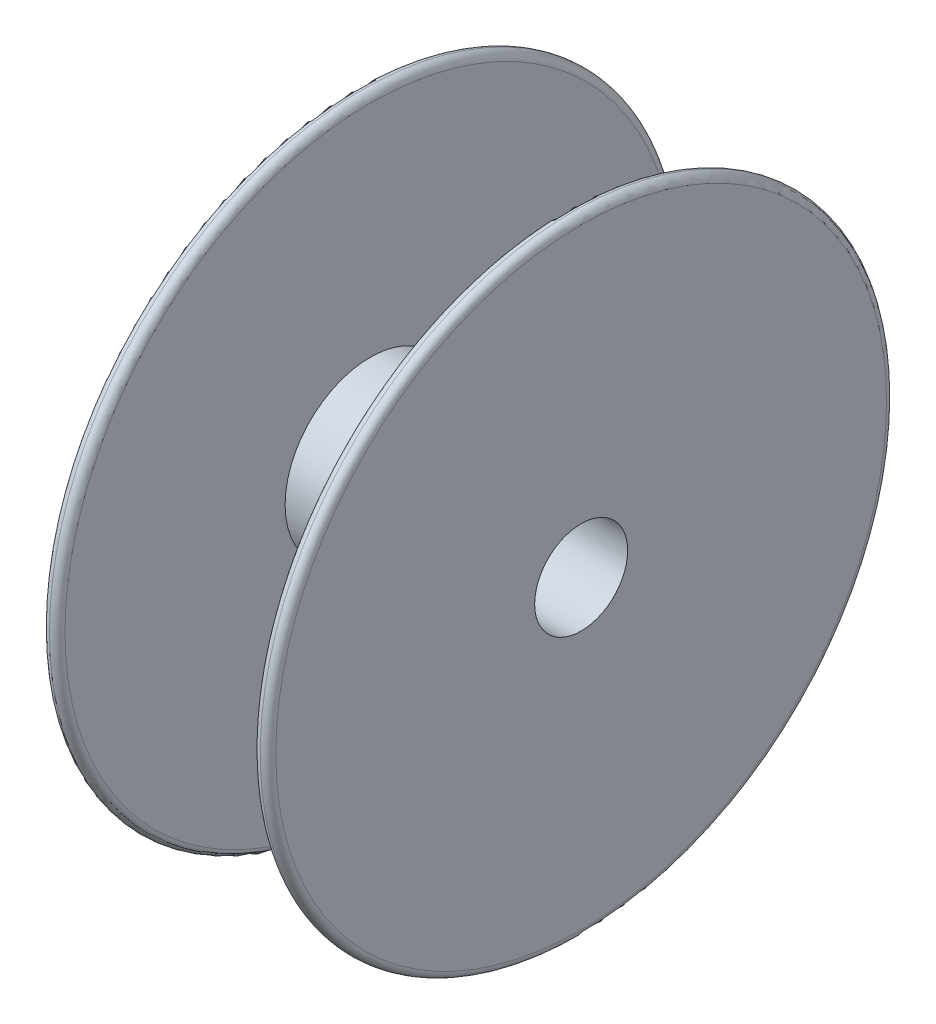
ISO-10303-21;
HEADER;
FILE_DESCRIPTION(('STEP AP214'),'2;1');
FILE_NAME('part.step','',(''),(''),'','','');
FILE_SCHEMA(('AUTOMOTIVE_DESIGN { 1 0 10303 214 1 1 1 1 }'));
ENDSEC;
DATA;
#1=APPLICATION_CONTEXT('core data for automotive mechanical design processes');
#2=APPLICATION_PROTOCOL_DEFINITION('international standard','automotive_design',2000,#1);
#3=PRODUCT_CONTEXT('',#1,'mechanical');
#4=PRODUCT('Part','Part','',(#3));
#5=PRODUCT_RELATED_PRODUCT_CATEGORY('part','',(#4));
#6=PRODUCT_DEFINITION_FORMATION('','',#4);
#7=PRODUCT_DEFINITION_CONTEXT('part definition',#1,'design');
#8=PRODUCT_DEFINITION('design','',#6,#7);
#9=PRODUCT_DEFINITION_SHAPE('','',#8);
#10=(LENGTH_UNIT() NAMED_UNIT(*) SI_UNIT(.MILLI.,.METRE.));
#11=(NAMED_UNIT(*) PLANE_ANGLE_UNIT() SI_UNIT($,.RADIAN.));
#12=(NAMED_UNIT(*) SI_UNIT($,.STERADIAN.) SOLID_ANGLE_UNIT());
#13=UNCERTAINTY_MEASURE_WITH_UNIT(LENGTH_MEASURE(1.E-05),#10,'distance_accuracy_value','');
#14=(GEOMETRIC_REPRESENTATION_CONTEXT(3) GLOBAL_UNCERTAINTY_ASSIGNED_CONTEXT((#13)) GLOBAL_UNIT_ASSIGNED_CONTEXT((#10,
#11,#12)) REPRESENTATION_CONTEXT('',''));
#15=CARTESIAN_POINT('',(0.,0.,0.));
#16=DIRECTION('',(0.,0.,1.));
#17=DIRECTION('',(1.,0.,0.));
#18=AXIS2_PLACEMENT_3D('',#15,#16,#17);
#19=CARTESIAN_POINT('',(63.,0.,0.));
#20=DIRECTION('',(-1.,0.,0.));
#21=DIRECTION('',(0.,0.,1.));
#22=AXIS2_PLACEMENT_3D('',#19,#20,#21);
#23=CYLINDRICAL_SURFACE('',#22,27.5);
#24=CARTESIAN_POINT('',(63.,0.,0.));
#25=DIRECTION('',(1.,0.,0.));
#26=DIRECTION('',(0.,0.,-1.));
#27=AXIS2_PLACEMENT_3D('',#24,#25,#26);
#28=CIRCLE('',#27,27.5);
#29=CARTESIAN_POINT('',(63.,0.,-27.5));
#30=VERTEX_POINT('',#29);
#31=EDGE_CURVE('E103',#30,#30,#28,.T.);
#32=ORIENTED_EDGE('',*,*,#31,.F.);
#33=EDGE_LOOP('',(#32));
#34=FACE_BOUND('',#33,.T.);
#35=CARTESIAN_POINT('',(0.,0.,0.));
#36=DIRECTION('',(-1.,0.,0.));
#37=DIRECTION('',(0.,0.,1.));
#38=AXIS2_PLACEMENT_3D('',#35,#36,#37);
#39=CIRCLE('',#38,27.5);
#40=CARTESIAN_POINT('',(0.,0.,27.5));
#41=VERTEX_POINT('',#40);
#42=EDGE_CURVE('E57',#41,#41,#39,.T.);
#43=ORIENTED_EDGE('',*,*,#42,.F.);
#44=EDGE_LOOP('',(#43));
#45=FACE_BOUND('',#44,.T.);
#46=ADVANCED_FACE('F35',(#34,#45),#23,.T.);
#47=CARTESIAN_POINT('',(63.,0.,0.));
#48=DIRECTION('',(-1.,0.,0.));
#49=DIRECTION('',(0.,0.,1.));
#50=AXIS2_PLACEMENT_3D('',#47,#48,#49);
#51=CYLINDRICAL_SURFACE('',#50,15.);
#52=CARTESIAN_POINT('',(68.,0.,0.));
#53=DIRECTION('',(1.,0.,0.));
#54=DIRECTION('',(0.,0.,-1.));
#55=AXIS2_PLACEMENT_3D('',#52,#53,#54);
#56=CIRCLE('',#55,15.);
#57=CARTESIAN_POINT('',(68.,0.,-15.));
#58=VERTEX_POINT('',#57);
#59=EDGE_CURVE('E108',#58,#58,#56,.T.);
#60=ORIENTED_EDGE('',*,*,#59,.T.);
#61=EDGE_LOOP('',(#60));
#62=FACE_BOUND('',#61,.T.);
#63=CARTESIAN_POINT('',(-5.,0.,0.));
#64=DIRECTION('',(-1.,0.,0.));
#65=DIRECTION('',(0.,0.,1.));
#66=AXIS2_PLACEMENT_3D('',#63,#64,#65);
#67=CIRCLE('',#66,15.);
#68=CARTESIAN_POINT('',(-5.,0.,15.));
#69=VERTEX_POINT('',#68);
#70=EDGE_CURVE('E53',#69,#69,#67,.T.);
#71=ORIENTED_EDGE('',*,*,#70,.T.);
#72=EDGE_LOOP('',(#71));
#73=FACE_BOUND('',#72,.T.);
#74=ADVANCED_FACE('F75',(#62,#73),#51,.F.);
#75=CARTESIAN_POINT('',(63.,0.,0.));
#76=DIRECTION('',(1.,0.,0.));
#77=DIRECTION('',(0.,0.,-1.));
#78=AXIS2_PLACEMENT_3D('',#75,#76,#77);
#79=PLANE('',#78);
#80=CARTESIAN_POINT('',(63.,0.,0.));
#81=DIRECTION('',(1.,0.,0.));
#82=DIRECTION('',(0.,0.,-1.));
#83=AXIS2_PLACEMENT_3D('',#80,#81,#82);
#84=CIRCLE('',#83,98.5);
#85=CARTESIAN_POINT('',(63.,0.,-98.5));
#86=VERTEX_POINT('',#85);
#87=EDGE_CURVE('E43',#86,#86,#84,.F.);
#88=ORIENTED_EDGE('',*,*,#87,.T.);
#89=EDGE_LOOP('',(#88));
#90=FACE_BOUND('',#89,.T.);
#91=ORIENTED_EDGE('',*,*,#31,.T.);
#92=EDGE_LOOP('',(#91));
#93=FACE_BOUND('',#92,.T.);
#94=ADVANCED_FACE('F81',(#90,#93),#79,.F.);
#95=CARTESIAN_POINT('',(68.,0.,0.));
#96=DIRECTION('',(1.,0.,0.));
#97=DIRECTION('',(0.,0.,-1.));
#98=AXIS2_PLACEMENT_3D('',#95,#96,#97);
#99=PLANE('',#98);
#100=CARTESIAN_POINT('',(68.,0.,0.));
#101=DIRECTION('',(1.,0.,0.));
#102=DIRECTION('',(0.,0.,-1.));
#103=AXIS2_PLACEMENT_3D('',#100,#101,#102);
#104=CIRCLE('',#103,98.5);
#105=CARTESIAN_POINT('',(68.,0.,-98.5));
#106=VERTEX_POINT('',#105);
#107=EDGE_CURVE('E10',#106,#106,#104,.T.);
#108=ORIENTED_EDGE('',*,*,#107,.T.);
#109=EDGE_LOOP('',(#108));
#110=FACE_BOUND('',#109,.T.);
#111=ORIENTED_EDGE('',*,*,#59,.F.);
#112=EDGE_LOOP('',(#111));
#113=FACE_BOUND('',#112,.T.);
#114=ADVANCED_FACE('F115',(#110,#113),#99,.T.);
#115=CARTESIAN_POINT('',(0.,0.,0.));
#116=DIRECTION('',(-1.,0.,0.));
#117=DIRECTION('',(0.,0.,1.));
#118=AXIS2_PLACEMENT_3D('',#115,#116,#117);
#119=PLANE('',#118);
#120=CARTESIAN_POINT('',(0.,0.,0.));
#121=DIRECTION('',(-1.,0.,0.));
#122=DIRECTION('',(0.,0.,1.));
#123=AXIS2_PLACEMENT_3D('',#120,#121,#122);
#124=CIRCLE('',#123,98.5);
#125=CARTESIAN_POINT('',(0.,0.,98.5));
#126=VERTEX_POINT('',#125);
#127=EDGE_CURVE('E48',#126,#126,#124,.F.);
#128=ORIENTED_EDGE('',*,*,#127,.T.);
#129=EDGE_LOOP('',(#128));
#130=FACE_BOUND('',#129,.T.);
#131=ORIENTED_EDGE('',*,*,#42,.T.);
#132=EDGE_LOOP('',(#131));
#133=FACE_BOUND('',#132,.T.);
#134=ADVANCED_FACE('F94',(#130,#133),#119,.F.);
#135=CARTESIAN_POINT('',(-5.,0.,0.));
#136=DIRECTION('',(-1.,0.,0.));
#137=DIRECTION('',(0.,0.,1.));
#138=AXIS2_PLACEMENT_3D('',#135,#136,#137);
#139=PLANE('',#138);
#140=CARTESIAN_POINT('',(-5.,0.,0.));
#141=DIRECTION('',(-1.,0.,0.));
#142=DIRECTION('',(0.,0.,1.));
#143=AXIS2_PLACEMENT_3D('',#140,#141,#142);
#144=CIRCLE('',#143,98.5);
#145=CARTESIAN_POINT('',(-5.,0.,98.5));
#146=VERTEX_POINT('',#145);
#147=EDGE_CURVE('E101',#146,#146,#144,.T.);
#148=ORIENTED_EDGE('',*,*,#147,.T.);
#149=EDGE_LOOP('',(#148));
#150=FACE_BOUND('',#149,.T.);
#151=ORIENTED_EDGE('',*,*,#70,.F.);
#152=EDGE_LOOP('',(#151));
#153=FACE_BOUND('',#152,.T.);
#154=ADVANCED_FACE('F89',(#150,#153),#139,.T.);
#155=CARTESIAN_POINT('',(-2.5,0.,0.));
#156=DIRECTION('',(-1.,0.,0.));
#157=DIRECTION('',(0.,0.,1.));
#158=AXIS2_PLACEMENT_3D('',#155,#156,#157);
#159=TOROIDAL_SURFACE('',#158,98.5,2.5);
#160=ORIENTED_EDGE('',*,*,#127,.F.);
#161=EDGE_LOOP('',(#160));
#162=FACE_BOUND('',#161,.T.);
#163=CARTESIAN_POINT('',(-2.5,0.,0.));
#164=DIRECTION('',(-1.,0.,0.));
#165=DIRECTION('',(0.,0.,1.));
#166=AXIS2_PLACEMENT_3D('',#163,#164,#165);
#167=CIRCLE('',#166,101.);
#168=CARTESIAN_POINT('',(-2.5,0.,101.));
#169=VERTEX_POINT('',#168);
#170=EDGE_CURVE('E51',#169,#169,#167,.T.);
#171=ORIENTED_EDGE('',*,*,#170,.F.);
#172=EDGE_LOOP('',(#171));
#173=FACE_BOUND('',#172,.T.);
#174=ADVANCED_FACE('F72',(#162,#173),#159,.T.);
#175=CARTESIAN_POINT('',(-2.5,0.,0.));
#176=DIRECTION('',(-1.,0.,0.));
#177=DIRECTION('',(0.,0.,1.));
#178=AXIS2_PLACEMENT_3D('',#175,#176,#177);
#179=TOROIDAL_SURFACE('',#178,98.5,2.5);
#180=ORIENTED_EDGE('',*,*,#170,.T.);
#181=EDGE_LOOP('',(#180));
#182=FACE_BOUND('',#181,.T.);
#183=ORIENTED_EDGE('',*,*,#147,.F.);
#184=EDGE_LOOP('',(#183));
#185=FACE_BOUND('',#184,.T.);
#186=ADVANCED_FACE('F65',(#182,#185),#179,.T.);
#187=CARTESIAN_POINT('',(65.5,0.,0.));
#188=DIRECTION('',(1.,0.,0.));
#189=DIRECTION('',(0.,0.,-1.));
#190=AXIS2_PLACEMENT_3D('',#187,#188,#189);
#191=TOROIDAL_SURFACE('',#190,98.5,2.5);
#192=ORIENTED_EDGE('',*,*,#107,.F.);
#193=EDGE_LOOP('',(#192));
#194=FACE_BOUND('',#193,.T.);
#195=CARTESIAN_POINT('',(65.5,0.,0.));
#196=DIRECTION('',(1.,0.,0.));
#197=DIRECTION('',(0.,0.,-1.));
#198=AXIS2_PLACEMENT_3D('',#195,#196,#197);
#199=CIRCLE('',#198,101.);
#200=CARTESIAN_POINT('',(65.5,0.,-101.));
#201=VERTEX_POINT('',#200);
#202=EDGE_CURVE('E39',#201,#201,#199,.F.);
#203=ORIENTED_EDGE('',*,*,#202,.F.);
#204=EDGE_LOOP('',(#203));
#205=FACE_BOUND('',#204,.T.);
#206=ADVANCED_FACE('F37',(#194,#205),#191,.T.);
#207=CARTESIAN_POINT('',(65.5,0.,0.));
#208=DIRECTION('',(1.,0.,0.));
#209=DIRECTION('',(0.,0.,-1.));
#210=AXIS2_PLACEMENT_3D('',#207,#208,#209);
#211=TOROIDAL_SURFACE('',#210,98.5,2.5);
#212=ORIENTED_EDGE('',*,*,#87,.F.);
#213=EDGE_LOOP('',(#212));
#214=FACE_BOUND('',#213,.T.);
#215=ORIENTED_EDGE('',*,*,#202,.T.);
#216=EDGE_LOOP('',(#215));
#217=FACE_BOUND('',#216,.T.);
#218=ADVANCED_FACE('F62',(#214,#217),#211,.T.);
#219=CLOSED_SHELL('',(#46,#74,#94,#114,#134,#154,#174,#186,#206,#218));
#220=MANIFOLD_SOLID_BREP('B2',#219);
#221=ADVANCED_BREP_SHAPE_REPRESENTATION('',(#18,#220),#14);
#222=SHAPE_DEFINITION_REPRESENTATION(#9,#221);
ENDSEC;
END-ISO-10303-21;
